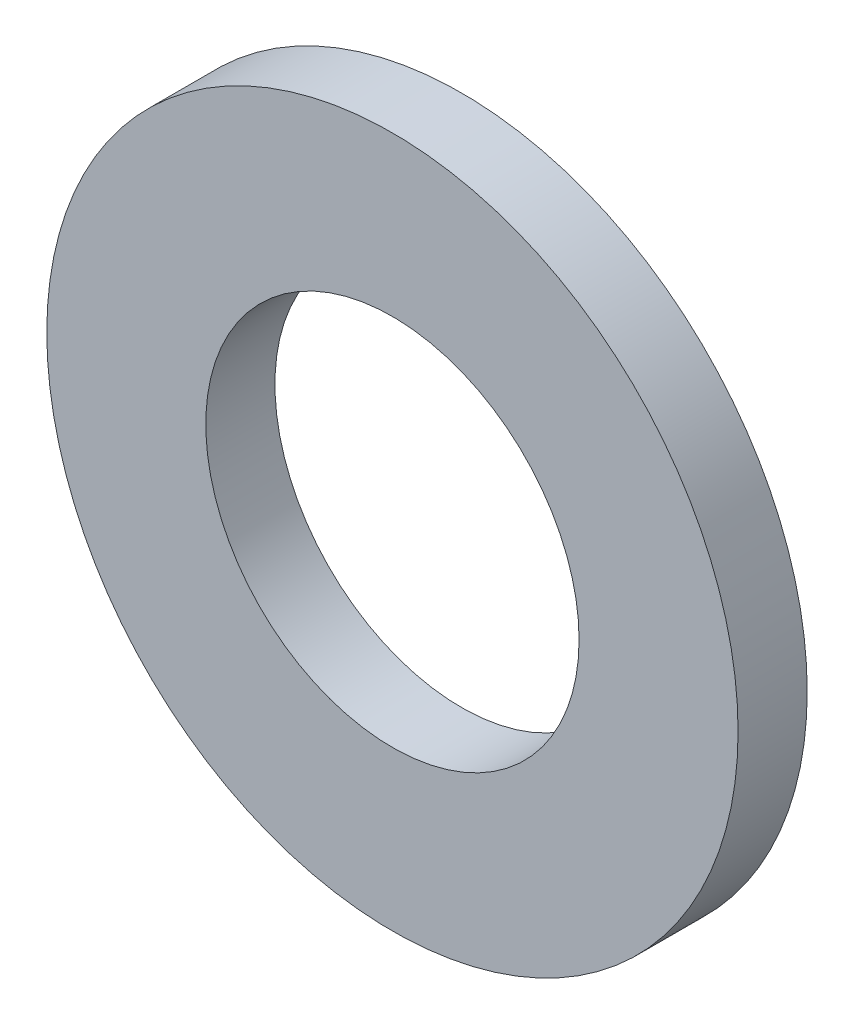
ISO-10303-21;
HEADER;
FILE_DESCRIPTION(('STEP AP214'),'2;1');
FILE_NAME('part.step','',(''),(''),'','','');
FILE_SCHEMA(('AUTOMOTIVE_DESIGN { 1 0 10303 214 1 1 1 1 }'));
ENDSEC;
DATA;
#1=APPLICATION_CONTEXT('core data for automotive mechanical design processes');
#2=APPLICATION_PROTOCOL_DEFINITION('international standard','automotive_design',2000,#1);
#3=PRODUCT_CONTEXT('',#1,'mechanical');
#4=PRODUCT('Part','Part','',(#3));
#5=PRODUCT_RELATED_PRODUCT_CATEGORY('part','',(#4));
#6=PRODUCT_DEFINITION_FORMATION('','',#4);
#7=PRODUCT_DEFINITION_CONTEXT('part definition',#1,'design');
#8=PRODUCT_DEFINITION('design','',#6,#7);
#9=PRODUCT_DEFINITION_SHAPE('','',#8);
#10=(LENGTH_UNIT() NAMED_UNIT(*) SI_UNIT(.MILLI.,.METRE.));
#11=(NAMED_UNIT(*) PLANE_ANGLE_UNIT() SI_UNIT($,.RADIAN.));
#12=(NAMED_UNIT(*) SI_UNIT($,.STERADIAN.) SOLID_ANGLE_UNIT());
#13=UNCERTAINTY_MEASURE_WITH_UNIT(LENGTH_MEASURE(1.E-05),#10,'distance_accuracy_value','');
#14=(GEOMETRIC_REPRESENTATION_CONTEXT(3) GLOBAL_UNCERTAINTY_ASSIGNED_CONTEXT((#13)) GLOBAL_UNIT_ASSIGNED_CONTEXT((#10,
#11,#12)) REPRESENTATION_CONTEXT('',''));
#15=CARTESIAN_POINT('',(0.,0.,0.));
#16=DIRECTION('',(0.,0.,1.));
#17=DIRECTION('',(1.,0.,0.));
#18=AXIS2_PLACEMENT_3D('',#15,#16,#17);
#19=CARTESIAN_POINT('',(0.,0.,1.));
#20=DIRECTION('',(0.,0.,-1.));
#21=DIRECTION('',(-1.,0.,0.));
#22=AXIS2_PLACEMENT_3D('',#19,#20,#21);
#23=CYLINDRICAL_SURFACE('',#22,5.);
#24=CARTESIAN_POINT('',(0.,0.,1.));
#25=DIRECTION('',(0.,0.,1.));
#26=DIRECTION('',(1.,0.,0.));
#27=AXIS2_PLACEMENT_3D('',#24,#25,#26);
#28=CIRCLE('',#27,5.);
#29=CARTESIAN_POINT('',(5.,0.,1.));
#30=VERTEX_POINT('',#29);
#31=EDGE_CURVE('E10',#30,#30,#28,.T.);
#32=ORIENTED_EDGE('',*,*,#31,.F.);
#33=EDGE_LOOP('',(#32));
#34=FACE_BOUND('',#33,.T.);
#35=CARTESIAN_POINT('',(0.,0.,0.));
#36=DIRECTION('',(0.,0.,1.));
#37=DIRECTION('',(1.,0.,0.));
#38=AXIS2_PLACEMENT_3D('',#35,#36,#37);
#39=CIRCLE('',#38,5.);
#40=CARTESIAN_POINT('',(5.,0.,0.));
#41=VERTEX_POINT('',#40);
#42=EDGE_CURVE('E40',#41,#41,#39,.T.);
#43=ORIENTED_EDGE('',*,*,#42,.T.);
#44=EDGE_LOOP('',(#43));
#45=FACE_BOUND('',#44,.T.);
#46=ADVANCED_FACE('F37',(#34,#45),#23,.T.);
#47=CARTESIAN_POINT('',(0.,0.,1.));
#48=DIRECTION('',(0.,0.,1.));
#49=DIRECTION('',(1.,0.,0.));
#50=AXIS2_PLACEMENT_3D('',#47,#48,#49);
#51=PLANE('',#50);
#52=CARTESIAN_POINT('',(0.,0.,1.));
#53=DIRECTION('',(0.,0.,1.));
#54=DIRECTION('',(1.,0.,0.));
#55=AXIS2_PLACEMENT_3D('',#52,#53,#54);
#56=CIRCLE('',#55,2.7);
#57=CARTESIAN_POINT('',(2.7,0.,1.));
#58=VERTEX_POINT('',#57);
#59=EDGE_CURVE('E47',#58,#58,#56,.T.);
#60=ORIENTED_EDGE('',*,*,#59,.F.);
#61=EDGE_LOOP('',(#60));
#62=FACE_BOUND('',#61,.T.);
#63=ORIENTED_EDGE('',*,*,#31,.T.);
#64=EDGE_LOOP('',(#63));
#65=FACE_BOUND('',#64,.T.);
#66=ADVANCED_FACE('F58',(#62,#65),#51,.T.);
#67=CARTESIAN_POINT('',(0.,0.,0.));
#68=DIRECTION('',(0.,0.,1.));
#69=DIRECTION('',(1.,0.,0.));
#70=AXIS2_PLACEMENT_3D('',#67,#68,#69);
#71=PLANE('',#70);
#72=CARTESIAN_POINT('',(0.,0.,0.));
#73=DIRECTION('',(0.,0.,1.));
#74=DIRECTION('',(1.,0.,0.));
#75=AXIS2_PLACEMENT_3D('',#72,#73,#74);
#76=CIRCLE('',#75,2.7);
#77=CARTESIAN_POINT('',(2.7,0.,0.));
#78=VERTEX_POINT('',#77);
#79=EDGE_CURVE('E49',#78,#78,#76,.T.);
#80=ORIENTED_EDGE('',*,*,#79,.T.);
#81=EDGE_LOOP('',(#80));
#82=FACE_BOUND('',#81,.T.);
#83=ORIENTED_EDGE('',*,*,#42,.F.);
#84=EDGE_LOOP('',(#83));
#85=FACE_BOUND('',#84,.T.);
#86=ADVANCED_FACE('F60',(#82,#85),#71,.F.);
#87=CARTESIAN_POINT('',(0.,0.,1.));
#88=DIRECTION('',(0.,0.,-1.));
#89=DIRECTION('',(-1.,0.,0.));
#90=AXIS2_PLACEMENT_3D('',#87,#88,#89);
#91=CYLINDRICAL_SURFACE('',#90,2.7);
#92=ORIENTED_EDGE('',*,*,#59,.T.);
#93=EDGE_LOOP('',(#92));
#94=FACE_BOUND('',#93,.T.);
#95=ORIENTED_EDGE('',*,*,#79,.F.);
#96=EDGE_LOOP('',(#95));
#97=FACE_BOUND('',#96,.T.);
#98=ADVANCED_FACE('F55',(#94,#97),#91,.F.);
#99=CLOSED_SHELL('',(#46,#66,#86,#98));
#100=MANIFOLD_SOLID_BREP('B2',#99);
#101=ADVANCED_BREP_SHAPE_REPRESENTATION('',(#18,#100),#14);
#102=SHAPE_DEFINITION_REPRESENTATION(#9,#101);
ENDSEC;
END-ISO-10303-21;
